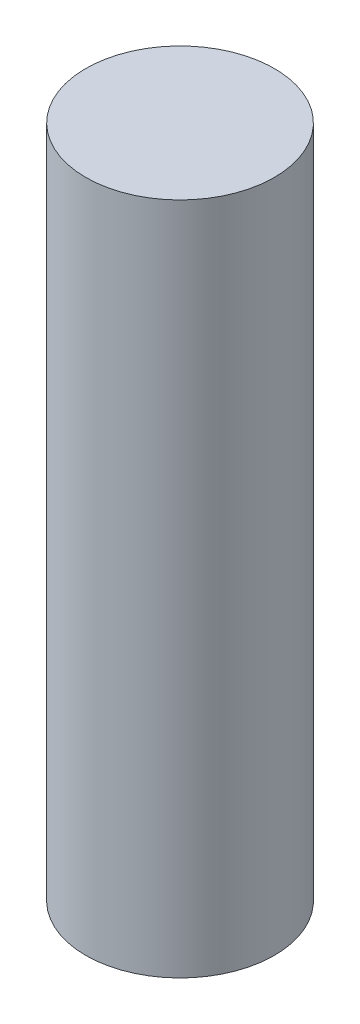
ISO-10303-21;
HEADER;
FILE_DESCRIPTION(('STEP AP214'),'2;1');
FILE_NAME('part.step','',(''),(''),'','','');
FILE_SCHEMA(('AUTOMOTIVE_DESIGN { 1 0 10303 214 1 1 1 1 }'));
ENDSEC;
DATA;
#1=APPLICATION_CONTEXT('core data for automotive mechanical design processes');
#2=APPLICATION_PROTOCOL_DEFINITION('international standard','automotive_design',2000,#1);
#3=PRODUCT_CONTEXT('',#1,'mechanical');
#4=PRODUCT('Part','Part','',(#3));
#5=PRODUCT_RELATED_PRODUCT_CATEGORY('part','',(#4));
#6=PRODUCT_DEFINITION_FORMATION('','',#4);
#7=PRODUCT_DEFINITION_CONTEXT('part definition',#1,'design');
#8=PRODUCT_DEFINITION('design','',#6,#7);
#9=PRODUCT_DEFINITION_SHAPE('','',#8);
#10=(LENGTH_UNIT() NAMED_UNIT(*) SI_UNIT(.MILLI.,.METRE.));
#11=(NAMED_UNIT(*) PLANE_ANGLE_UNIT() SI_UNIT($,.RADIAN.));
#12=(NAMED_UNIT(*) SI_UNIT($,.STERADIAN.) SOLID_ANGLE_UNIT());
#13=UNCERTAINTY_MEASURE_WITH_UNIT(LENGTH_MEASURE(1.E-05),#10,'distance_accuracy_value','');
#14=(GEOMETRIC_REPRESENTATION_CONTEXT(3) GLOBAL_UNCERTAINTY_ASSIGNED_CONTEXT((#13)) GLOBAL_UNIT_ASSIGNED_CONTEXT((#10,
#11,#12)) REPRESENTATION_CONTEXT('',''));
#15=CARTESIAN_POINT('',(0.,0.,0.));
#16=DIRECTION('',(0.,0.,1.));
#17=DIRECTION('',(1.,0.,0.));
#18=AXIS2_PLACEMENT_3D('',#15,#16,#17);
#19=CARTESIAN_POINT('',(0.,25.,0.));
#20=DIRECTION('',(0.,-1.,0.));
#21=DIRECTION('',(0.,0.,-1.));
#22=AXIS2_PLACEMENT_3D('',#19,#20,#21);
#23=CYLINDRICAL_SURFACE('',#22,3.5);
#24=CARTESIAN_POINT('',(0.,25.,0.));
#25=DIRECTION('',(0.,1.,0.));
#26=DIRECTION('',(0.,0.,1.));
#27=AXIS2_PLACEMENT_3D('',#24,#25,#26);
#28=CIRCLE('',#27,3.5);
#29=CARTESIAN_POINT('',(0.,25.,3.5));
#30=VERTEX_POINT('',#29);
#31=EDGE_CURVE('E10',#30,#30,#28,.T.);
#32=ORIENTED_EDGE('',*,*,#31,.F.);
#33=EDGE_LOOP('',(#32));
#34=FACE_BOUND('',#33,.T.);
#35=CARTESIAN_POINT('',(0.,0.,0.));
#36=DIRECTION('',(0.,1.,0.));
#37=DIRECTION('',(0.,0.,1.));
#38=AXIS2_PLACEMENT_3D('',#35,#36,#37);
#39=CIRCLE('',#38,3.5);
#40=CARTESIAN_POINT('',(0.,0.,3.5));
#41=VERTEX_POINT('',#40);
#42=EDGE_CURVE('E34',#41,#41,#39,.T.);
#43=ORIENTED_EDGE('',*,*,#42,.T.);
#44=EDGE_LOOP('',(#43));
#45=FACE_BOUND('',#44,.T.);
#46=ADVANCED_FACE('F31',(#34,#45),#23,.T.);
#47=CARTESIAN_POINT('',(0.,25.,0.));
#48=DIRECTION('',(0.,1.,0.));
#49=DIRECTION('',(0.,0.,1.));
#50=AXIS2_PLACEMENT_3D('',#47,#48,#49);
#51=PLANE('',#50);
#52=ORIENTED_EDGE('',*,*,#31,.T.);
#53=EDGE_LOOP('',(#52));
#54=FACE_BOUND('',#53,.T.);
#55=ADVANCED_FACE('F46',(#54),#51,.T.);
#56=CARTESIAN_POINT('',(0.,0.,0.));
#57=DIRECTION('',(0.,1.,0.));
#58=DIRECTION('',(0.,0.,1.));
#59=AXIS2_PLACEMENT_3D('',#56,#57,#58);
#60=PLANE('',#59);
#61=ORIENTED_EDGE('',*,*,#42,.F.);
#62=EDGE_LOOP('',(#61));
#63=FACE_BOUND('',#62,.T.);
#64=ADVANCED_FACE('F44',(#63),#60,.F.);
#65=CLOSED_SHELL('',(#46,#55,#64));
#66=MANIFOLD_SOLID_BREP('B2',#65);
#67=ADVANCED_BREP_SHAPE_REPRESENTATION('',(#18,#66),#14);
#68=SHAPE_DEFINITION_REPRESENTATION(#9,#67);
ENDSEC;
END-ISO-10303-21;
